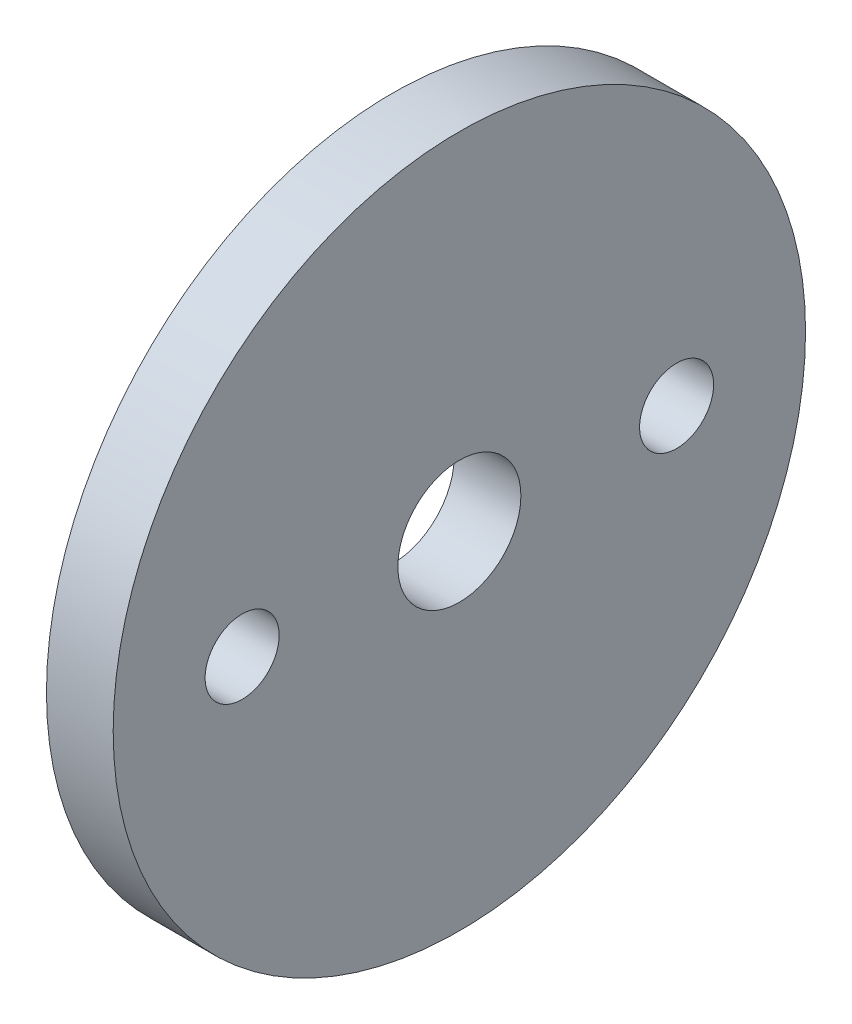
ISO-10303-21;
HEADER;
FILE_DESCRIPTION(('STEP AP214'),'2;1');
FILE_NAME('part.step','',(''),(''),'','','');
FILE_SCHEMA(('AUTOMOTIVE_DESIGN { 1 0 10303 214 1 1 1 1 }'));
ENDSEC;
DATA;
#1=APPLICATION_CONTEXT('core data for automotive mechanical design processes');
#2=APPLICATION_PROTOCOL_DEFINITION('international standard','automotive_design',2000,#1);
#3=PRODUCT_CONTEXT('',#1,'mechanical');
#4=PRODUCT('Part','Part','',(#3));
#5=PRODUCT_RELATED_PRODUCT_CATEGORY('part','',(#4));
#6=PRODUCT_DEFINITION_FORMATION('','',#4);
#7=PRODUCT_DEFINITION_CONTEXT('part definition',#1,'design');
#8=PRODUCT_DEFINITION('design','',#6,#7);
#9=PRODUCT_DEFINITION_SHAPE('','',#8);
#10=(LENGTH_UNIT() NAMED_UNIT(*) SI_UNIT(.MILLI.,.METRE.));
#11=(NAMED_UNIT(*) PLANE_ANGLE_UNIT() SI_UNIT($,.RADIAN.));
#12=(NAMED_UNIT(*) SI_UNIT($,.STERADIAN.) SOLID_ANGLE_UNIT());
#13=UNCERTAINTY_MEASURE_WITH_UNIT(LENGTH_MEASURE(1.E-05),#10,'distance_accuracy_value','');
#14=(GEOMETRIC_REPRESENTATION_CONTEXT(3) GLOBAL_UNCERTAINTY_ASSIGNED_CONTEXT((#13)) GLOBAL_UNIT_ASSIGNED_CONTEXT((#10,
#11,#12)) REPRESENTATION_CONTEXT('',''));
#15=CARTESIAN_POINT('',(0.,0.,0.));
#16=DIRECTION('',(0.,0.,1.));
#17=DIRECTION('',(1.,0.,0.));
#18=AXIS2_PLACEMENT_3D('',#15,#16,#17);
#19=CARTESIAN_POINT('',(2.4384,0.,0.));
#20=DIRECTION('',(-1.,0.,0.));
#21=DIRECTION('',(0.,0.,1.));
#22=AXIS2_PLACEMENT_3D('',#19,#20,#21);
#23=CYLINDRICAL_SURFACE('',#22,12.6492);
#24=CARTESIAN_POINT('',(2.4384,0.,0.));
#25=DIRECTION('',(1.,0.,0.));
#26=DIRECTION('',(0.,0.,-1.));
#27=AXIS2_PLACEMENT_3D('',#24,#25,#26);
#28=CIRCLE('',#27,12.6492);
#29=CARTESIAN_POINT('',(2.4384,0.,-12.6492));
#30=VERTEX_POINT('',#29);
#31=EDGE_CURVE('E10',#30,#30,#28,.T.);
#32=ORIENTED_EDGE('',*,*,#31,.F.);
#33=EDGE_LOOP('',(#32));
#34=FACE_BOUND('',#33,.T.);
#35=CARTESIAN_POINT('',(0.,0.,0.));
#36=DIRECTION('',(1.,0.,0.));
#37=DIRECTION('',(0.,0.,-1.));
#38=AXIS2_PLACEMENT_3D('',#35,#36,#37);
#39=CIRCLE('',#38,12.6492);
#40=CARTESIAN_POINT('',(0.,0.,-12.6492));
#41=VERTEX_POINT('',#40);
#42=EDGE_CURVE('E46',#41,#41,#39,.T.);
#43=ORIENTED_EDGE('',*,*,#42,.T.);
#44=EDGE_LOOP('',(#43));
#45=FACE_BOUND('',#44,.T.);
#46=ADVANCED_FACE('F43',(#34,#45),#23,.T.);
#47=CARTESIAN_POINT('',(2.4384,0.,0.));
#48=DIRECTION('',(1.,0.,0.));
#49=DIRECTION('',(0.,0.,-1.));
#50=AXIS2_PLACEMENT_3D('',#47,#48,#49);
#51=PLANE('',#50);
#52=CARTESIAN_POINT('',(2.4384,0.,7.9375));
#53=DIRECTION('',(1.,0.,0.));
#54=DIRECTION('',(0.,0.,-1.));
#55=AXIS2_PLACEMENT_3D('',#52,#53,#54);
#56=CIRCLE('',#55,1.35255);
#57=CARTESIAN_POINT('',(2.4384,0.,6.58495));
#58=VERTEX_POINT('',#57);
#59=EDGE_CURVE('E69',#58,#58,#56,.T.);
#60=ORIENTED_EDGE('',*,*,#59,.F.);
#61=EDGE_LOOP('',(#60));
#62=FACE_BOUND('',#61,.T.);
#63=CARTESIAN_POINT('',(2.4384,0.,-7.9375));
#64=DIRECTION('',(1.,0.,0.));
#65=DIRECTION('',(0.,0.,-1.));
#66=AXIS2_PLACEMENT_3D('',#63,#64,#65);
#67=CIRCLE('',#66,1.35255);
#68=CARTESIAN_POINT('',(2.4384,0.,-9.29005));
#69=VERTEX_POINT('',#68);
#70=EDGE_CURVE('E63',#69,#69,#67,.T.);
#71=ORIENTED_EDGE('',*,*,#70,.F.);
#72=EDGE_LOOP('',(#71));
#73=FACE_BOUND('',#72,.T.);
#74=CARTESIAN_POINT('',(2.4384,0.,0.));
#75=DIRECTION('',(1.,0.,0.));
#76=DIRECTION('',(0.,0.,-1.));
#77=AXIS2_PLACEMENT_3D('',#74,#75,#76);
#78=CIRCLE('',#77,2.2479);
#79=CARTESIAN_POINT('',(2.4384,0.,-2.2479));
#80=VERTEX_POINT('',#79);
#81=EDGE_CURVE('E57',#80,#80,#78,.T.);
#82=ORIENTED_EDGE('',*,*,#81,.F.);
#83=EDGE_LOOP('',(#82));
#84=FACE_BOUND('',#83,.T.);
#85=ORIENTED_EDGE('',*,*,#31,.T.);
#86=EDGE_LOOP('',(#85));
#87=FACE_BOUND('',#86,.T.);
#88=ADVANCED_FACE('F75',(#62,#73,#84,#87),#51,.T.);
#89=CARTESIAN_POINT('',(0.,0.,0.));
#90=DIRECTION('',(1.,0.,0.));
#91=DIRECTION('',(0.,0.,-1.));
#92=AXIS2_PLACEMENT_3D('',#89,#90,#91);
#93=PLANE('',#92);
#94=CARTESIAN_POINT('',(0.,0.,7.9375));
#95=DIRECTION('',(1.,0.,0.));
#96=DIRECTION('',(0.,0.,-1.));
#97=AXIS2_PLACEMENT_3D('',#94,#95,#96);
#98=CIRCLE('',#97,1.35255);
#99=CARTESIAN_POINT('',(0.,0.,6.58495));
#100=VERTEX_POINT('',#99);
#101=EDGE_CURVE('E66',#100,#100,#98,.T.);
#102=ORIENTED_EDGE('',*,*,#101,.T.);
#103=EDGE_LOOP('',(#102));
#104=FACE_BOUND('',#103,.T.);
#105=CARTESIAN_POINT('',(0.,0.,-7.9375));
#106=DIRECTION('',(1.,0.,0.));
#107=DIRECTION('',(0.,0.,-1.));
#108=AXIS2_PLACEMENT_3D('',#105,#106,#107);
#109=CIRCLE('',#108,1.35255);
#110=CARTESIAN_POINT('',(0.,0.,-9.29005));
#111=VERTEX_POINT('',#110);
#112=EDGE_CURVE('E60',#111,#111,#109,.T.);
#113=ORIENTED_EDGE('',*,*,#112,.T.);
#114=EDGE_LOOP('',(#113));
#115=FACE_BOUND('',#114,.T.);
#116=CARTESIAN_POINT('',(0.,0.,0.));
#117=DIRECTION('',(1.,0.,0.));
#118=DIRECTION('',(0.,0.,-1.));
#119=AXIS2_PLACEMENT_3D('',#116,#117,#118);
#120=CIRCLE('',#119,2.2479);
#121=CARTESIAN_POINT('',(0.,0.,-2.2479));
#122=VERTEX_POINT('',#121);
#123=EDGE_CURVE('E53',#122,#122,#120,.T.);
#124=ORIENTED_EDGE('',*,*,#123,.T.);
#125=EDGE_LOOP('',(#124));
#126=FACE_BOUND('',#125,.T.);
#127=ORIENTED_EDGE('',*,*,#42,.F.);
#128=EDGE_LOOP('',(#127));
#129=FACE_BOUND('',#128,.T.);
#130=ADVANCED_FACE('F78',(#104,#115,#126,#129),#93,.F.);
#131=CARTESIAN_POINT('',(2.4384,0.,0.));
#132=DIRECTION('',(1.,0.,0.));
#133=DIRECTION('',(0.,0.,-1.));
#134=AXIS2_PLACEMENT_3D('',#131,#132,#133);
#135=CYLINDRICAL_SURFACE('',#134,2.2479);
#136=ORIENTED_EDGE('',*,*,#123,.F.);
#137=EDGE_LOOP('',(#136));
#138=FACE_BOUND('',#137,.T.);
#139=ORIENTED_EDGE('',*,*,#81,.T.);
#140=EDGE_LOOP('',(#139));
#141=FACE_BOUND('',#140,.T.);
#142=ADVANCED_FACE('F84',(#138,#141),#135,.F.);
#143=CARTESIAN_POINT('',(2.4384,0.,-7.9375));
#144=DIRECTION('',(1.,0.,0.));
#145=DIRECTION('',(0.,0.,-1.));
#146=AXIS2_PLACEMENT_3D('',#143,#144,#145);
#147=CYLINDRICAL_SURFACE('',#146,1.35255);
#148=ORIENTED_EDGE('',*,*,#112,.F.);
#149=EDGE_LOOP('',(#148));
#150=FACE_BOUND('',#149,.T.);
#151=ORIENTED_EDGE('',*,*,#70,.T.);
#152=EDGE_LOOP('',(#151));
#153=FACE_BOUND('',#152,.T.);
#154=ADVANCED_FACE('F86',(#150,#153),#147,.F.);
#155=CARTESIAN_POINT('',(2.4384,0.,7.9375));
#156=DIRECTION('',(1.,0.,0.));
#157=DIRECTION('',(0.,0.,-1.));
#158=AXIS2_PLACEMENT_3D('',#155,#156,#157);
#159=CYLINDRICAL_SURFACE('',#158,1.35255);
#160=ORIENTED_EDGE('',*,*,#101,.F.);
#161=EDGE_LOOP('',(#160));
#162=FACE_BOUND('',#161,.T.);
#163=ORIENTED_EDGE('',*,*,#59,.T.);
#164=EDGE_LOOP('',(#163));
#165=FACE_BOUND('',#164,.T.);
#166=ADVANCED_FACE('F73',(#162,#165),#159,.F.);
#167=CLOSED_SHELL('',(#46,#88,#130,#142,#154,#166));
#168=MANIFOLD_SOLID_BREP('B2',#167);
#169=ADVANCED_BREP_SHAPE_REPRESENTATION('',(#18,#168),#14);
#170=SHAPE_DEFINITION_REPRESENTATION(#9,#169);
ENDSEC;
END-ISO-10303-21;
